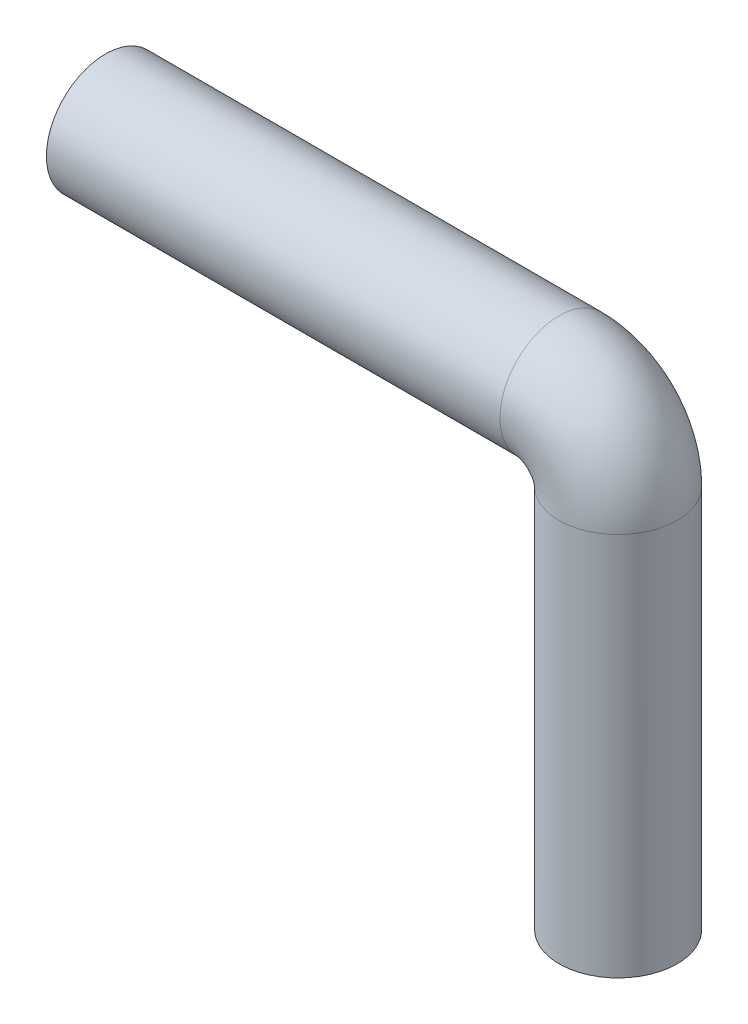
ISO-10303-21;
HEADER;
FILE_DESCRIPTION(('STEP AP214'),'2;1');
FILE_NAME('part.step','',(''),(''),'','','');
FILE_SCHEMA(('AUTOMOTIVE_DESIGN { 1 0 10303 214 1 1 1 1 }'));
ENDSEC;
DATA;
#1=APPLICATION_CONTEXT('core data for automotive mechanical design processes');
#2=APPLICATION_PROTOCOL_DEFINITION('international standard','automotive_design',2000,#1);
#3=PRODUCT_CONTEXT('',#1,'mechanical');
#4=PRODUCT('Part','Part','',(#3));
#5=PRODUCT_RELATED_PRODUCT_CATEGORY('part','',(#4));
#6=PRODUCT_DEFINITION_FORMATION('','',#4);
#7=PRODUCT_DEFINITION_CONTEXT('part definition',#1,'design');
#8=PRODUCT_DEFINITION('design','',#6,#7);
#9=PRODUCT_DEFINITION_SHAPE('','',#8);
#10=(LENGTH_UNIT() NAMED_UNIT(*) SI_UNIT(.MILLI.,.METRE.));
#11=(NAMED_UNIT(*) PLANE_ANGLE_UNIT() SI_UNIT($,.RADIAN.));
#12=(NAMED_UNIT(*) SI_UNIT($,.STERADIAN.) SOLID_ANGLE_UNIT());
#13=UNCERTAINTY_MEASURE_WITH_UNIT(LENGTH_MEASURE(1.E-05),#10,'distance_accuracy_value','');
#14=(GEOMETRIC_REPRESENTATION_CONTEXT(3) GLOBAL_UNCERTAINTY_ASSIGNED_CONTEXT((#13)) GLOBAL_UNIT_ASSIGNED_CONTEXT((#10,
#11,#12)) REPRESENTATION_CONTEXT('',''));
#15=CARTESIAN_POINT('',(0.,0.,0.));
#16=DIRECTION('',(0.,0.,1.));
#17=DIRECTION('',(1.,0.,0.));
#18=AXIS2_PLACEMENT_3D('',#15,#16,#17);
#19=CARTESIAN_POINT('',(18.2653622735561,-23.5332632350783,0.));
#20=DIRECTION('',(0.,-1.,0.));
#21=DIRECTION('',(0.,0.,-1.));
#22=AXIS2_PLACEMENT_3D('',#19,#20,#21);
#23=PLANE('',#22);
#24=CARTESIAN_POINT('',(18.2653622735561,-23.5332632350783,0.));
#25=DIRECTION('',(0.,-1.,0.));
#26=DIRECTION('',(0.,0.,-1.));
#27=AXIS2_PLACEMENT_3D('',#24,#25,#26);
#28=CIRCLE('',#27,2.);
#29=CARTESIAN_POINT('',(18.2653622735561,-23.5332632350783,-2.));
#30=VERTEX_POINT('',#29);
#31=EDGE_CURVE('E41',#30,#30,#28,.T.);
#32=ORIENTED_EDGE('',*,*,#31,.T.);
#33=EDGE_LOOP('',(#32));
#34=FACE_BOUND('',#33,.T.);
#35=ADVANCED_FACE('F33',(#34),#23,.T.);
#36=CARTESIAN_POINT('',(14.2653622735562,-10.5332632350783,0.));
#37=DIRECTION('',(0.,-1.,0.));
#38=DIRECTION('',(-1.,0.,0.));
#39=AXIS2_PLACEMENT_3D('',#36,#37,#38);
#40=CIRCLE('',#39,2.);
#41=TRIMMED_CURVE('',#40,(PARAMETER_VALUE(-3.14159231510048)),
(PARAMETER_VALUE(3.14159231510048)),.T.,.PARAMETER.);
#42=CARTESIAN_POINT('',(16.2653622735561,-10.5332632350783,0.));
#43=DIRECTION('',(0.,0.,-1.));
#44=AXIS1_PLACEMENT('',#42,#43);
#45=SURFACE_OF_REVOLUTION('',#41,#44);
#46=CARTESIAN_POINT('',(16.2653622735561,-8.53326323507829,0.));
#47=DIRECTION('',(1.,0.,0.));
#48=DIRECTION('',(0.,0.,-1.));
#49=AXIS2_PLACEMENT_3D('',#46,#47,#48);
#50=CIRCLE('',#49,2.);
#51=CARTESIAN_POINT('',(16.2653622735561,-10.5332632350783,0.));
#52=VERTEX_POINT('',#51);
#53=EDGE_CURVE('E53',#52,#52,#50,.T.);
#54=ORIENTED_EDGE('',*,*,#53,.T.);
#55=CARTESIAN_POINT('',(18.2653622735561,-10.5332632350783,0.));
#56=DIRECTION('',(0.,-1.,0.));
#57=DIRECTION('',(0.,0.,-1.));
#58=AXIS2_PLACEMENT_3D('',#55,#56,#57);
#59=CIRCLE('',#58,2.);
#60=EDGE_CURVE('E49',#52,#52,#59,.T.);
#61=ORIENTED_EDGE('',*,*,#60,.F.);
#62=EDGE_LOOP('',(#54,#61));
#63=FACE_BOUND('',#62,.T.);
#64=ADVANCED_FACE('F56',(#63),#45,.T.);
#65=CARTESIAN_POINT('',(18.2653622735561,-10.5332632350783,0.));
#66=DIRECTION('',(0.,-1.,0.));
#67=DIRECTION('',(1.,0.,0.));
#68=AXIS2_PLACEMENT_3D('',#65,#66,#67);
#69=CYLINDRICAL_SURFACE('',#68,2.);
#70=ORIENTED_EDGE('',*,*,#31,.F.);
#71=EDGE_LOOP('',(#70));
#72=FACE_BOUND('',#71,.T.);
#73=ORIENTED_EDGE('',*,*,#60,.T.);
#74=EDGE_LOOP('',(#73));
#75=FACE_BOUND('',#74,.T.);
#76=ADVANCED_FACE('F51',(#72,#75),#69,.T.);
#77=CARTESIAN_POINT('',(0.912123334161096,-7.98326323507829,0.));
#78=DIRECTION('',(-1.,0.,0.));
#79=DIRECTION('',(0.,0.,1.));
#80=AXIS2_PLACEMENT_3D('',#77,#78,#79);
#81=PLANE('',#80);
#82=CARTESIAN_POINT('',(0.912123334161097,-8.53326323507829,0.));
#83=DIRECTION('',(-1.,0.,0.));
#84=DIRECTION('',(0.,0.,1.));
#85=AXIS2_PLACEMENT_3D('',#82,#83,#84);
#86=CIRCLE('',#85,2.);
#87=CARTESIAN_POINT('',(0.912123334161097,-8.53326323507829,2.));
#88=VERTEX_POINT('',#87);
#89=EDGE_CURVE('E11',#88,#88,#86,.T.);
#90=ORIENTED_EDGE('',*,*,#89,.T.);
#91=EDGE_LOOP('',(#90));
#92=FACE_BOUND('',#91,.T.);
#93=ADVANCED_FACE('F35',(#92),#81,.T.);
#94=CARTESIAN_POINT('',(12.1757416936097,-8.53326323507829,0.));
#95=DIRECTION('',(-1.,0.,0.));
#96=DIRECTION('',(0.,0.,1.));
#97=AXIS2_PLACEMENT_3D('',#94,#95,#96);
#98=CYLINDRICAL_SURFACE('',#97,2.);
#99=ORIENTED_EDGE('',*,*,#89,.F.);
#100=EDGE_LOOP('',(#99));
#101=FACE_BOUND('',#100,.T.);
#102=ORIENTED_EDGE('',*,*,#53,.F.);
#103=EDGE_LOOP('',(#102));
#104=FACE_BOUND('',#103,.T.);
#105=ADVANCED_FACE('F59',(#101,#104),#98,.T.);
#106=CLOSED_SHELL('',(#35,#64,#76,#93,#105));
#107=MANIFOLD_SOLID_BREP('B2',#106);
#108=ADVANCED_BREP_SHAPE_REPRESENTATION('',(#18,#107),#14);
#109=SHAPE_DEFINITION_REPRESENTATION(#9,#108);
ENDSEC;
END-ISO-10303-21;
